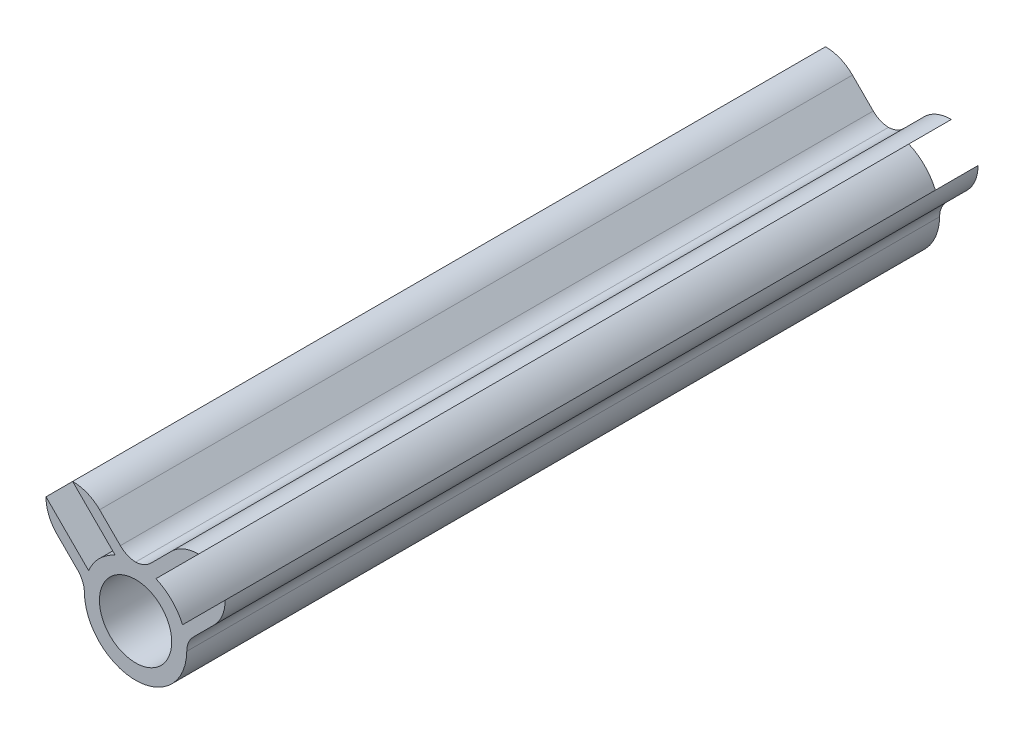
ISO-10303-21;
HEADER;
FILE_DESCRIPTION(('STEP AP214'),'2;1');
FILE_NAME('part.step','',(''),(''),'','','');
FILE_SCHEMA(('AUTOMOTIVE_DESIGN { 1 0 10303 214 1 1 1 1 }'));
ENDSEC;
DATA;
#1=APPLICATION_CONTEXT('core data for automotive mechanical design processes');
#2=APPLICATION_PROTOCOL_DEFINITION('international standard','automotive_design',2000,#1);
#3=PRODUCT_CONTEXT('',#1,'mechanical');
#4=PRODUCT('Part','Part','',(#3));
#5=PRODUCT_RELATED_PRODUCT_CATEGORY('part','',(#4));
#6=PRODUCT_DEFINITION_FORMATION('','',#4);
#7=PRODUCT_DEFINITION_CONTEXT('part definition',#1,'design');
#8=PRODUCT_DEFINITION('design','',#6,#7);
#9=PRODUCT_DEFINITION_SHAPE('','',#8);
#10=(LENGTH_UNIT() NAMED_UNIT(*) SI_UNIT(.MILLI.,.METRE.));
#11=(NAMED_UNIT(*) PLANE_ANGLE_UNIT() SI_UNIT($,.RADIAN.));
#12=(NAMED_UNIT(*) SI_UNIT($,.STERADIAN.) SOLID_ANGLE_UNIT());
#13=UNCERTAINTY_MEASURE_WITH_UNIT(LENGTH_MEASURE(1.E-05),#10,'distance_accuracy_value','');
#14=(GEOMETRIC_REPRESENTATION_CONTEXT(3) GLOBAL_UNCERTAINTY_ASSIGNED_CONTEXT((#13)) GLOBAL_UNIT_ASSIGNED_CONTEXT((#10,
#11,#12)) REPRESENTATION_CONTEXT('',''));
#15=CARTESIAN_POINT('',(0.,0.,0.));
#16=DIRECTION('',(0.,0.,1.));
#17=DIRECTION('',(1.,0.,0.));
#18=AXIS2_PLACEMENT_3D('',#15,#16,#17);
#19=CARTESIAN_POINT('',(0.,0.,50.));
#20=DIRECTION('',(0.,0.,-1.));
#21=DIRECTION('',(-1.,0.,0.));
#22=AXIS2_PLACEMENT_3D('',#19,#20,#21);
#23=CYLINDRICAL_SURFACE('',#22,6.8);
#24=CARTESIAN_POINT('',(0.,0.,-50.));
#25=DIRECTION('',(0.,0.,1.));
#26=DIRECTION('',(1.,0.,0.));
#27=AXIS2_PLACEMENT_3D('',#24,#25,#26);
#28=CIRCLE('',#27,6.8);
#29=CARTESIAN_POINT('',(-2.7038099500959,6.23934385602865,-50.));
#30=VERTEX_POINT('',#29);
#31=CARTESIAN_POINT('',(-6.23934385602864,2.70380995009592,-50.));
#32=VERTEX_POINT('',#31);
#33=EDGE_CURVE('E248',#30,#32,#28,.T.);
#34=ORIENTED_EDGE('',*,*,#33,.T.);
#35=DIRECTION('',(0.,0.,1.));
#36=VECTOR('',#35,1.);
#37=CARTESIAN_POINT('',(-6.23934385602864,2.70380995009592,-79.4106154263704));
#38=LINE('',#37,#36);
#39=CARTESIAN_POINT('',(-6.23934385602864,2.70380995009591,50.));
#40=VERTEX_POINT('',#39);
#41=EDGE_CURVE('E215',#32,#40,#38,.T.);
#42=ORIENTED_EDGE('',*,*,#41,.T.);
#43=CARTESIAN_POINT('',(0.,0.,50.));
#44=DIRECTION('',(0.,0.,1.));
#45=DIRECTION('',(1.,0.,0.));
#46=AXIS2_PLACEMENT_3D('',#43,#44,#45);
#47=CIRCLE('',#46,6.8);
#48=CARTESIAN_POINT('',(-2.7038099500959,6.23934385602865,50.));
#49=VERTEX_POINT('',#48);
#50=EDGE_CURVE('E191',#49,#40,#47,.T.);
#51=ORIENTED_EDGE('',*,*,#50,.F.);
#52=DIRECTION('',(0.,0.,1.));
#53=VECTOR('',#52,1.);
#54=CARTESIAN_POINT('',(-2.7038099500959,6.23934385602865,-79.4106154263704));
#55=LINE('',#54,#53);
#56=EDGE_CURVE('E218',#30,#49,#55,.T.);
#57=ORIENTED_EDGE('',*,*,#56,.F.);
#58=EDGE_LOOP('',(#34,#42,#51,#57));
#59=FACE_BOUND('',#58,.T.);
#60=ADVANCED_FACE('F32',(#59),#23,.T.);
#61=CARTESIAN_POINT('',(6.23934385602864,2.70380995009592,-50.));
#62=VERTEX_POINT('',#61);
#63=CARTESIAN_POINT('',(2.70380995009589,6.23934385602865,-50.));
#64=VERTEX_POINT('',#63);
#65=EDGE_CURVE('E244',#62,#64,#28,.T.);
#66=ORIENTED_EDGE('',*,*,#65,.T.);
#67=DIRECTION('',(0.,0.,1.));
#68=VECTOR('',#67,1.);
#69=CARTESIAN_POINT('',(2.7038099500959,6.23934385602865,-79.4106154263704));
#70=LINE('',#69,#68);
#71=CARTESIAN_POINT('',(2.70380995009589,6.23934385602865,50.));
#72=VERTEX_POINT('',#71);
#73=EDGE_CURVE('E227',#64,#72,#70,.T.);
#74=ORIENTED_EDGE('',*,*,#73,.T.);
#75=CARTESIAN_POINT('',(6.23934385602864,2.70380995009592,50.));
#76=VERTEX_POINT('',#75);
#77=EDGE_CURVE('E245',#76,#72,#47,.T.);
#78=ORIENTED_EDGE('',*,*,#77,.F.);
#79=DIRECTION('',(0.,0.,1.));
#80=VECTOR('',#79,1.);
#81=CARTESIAN_POINT('',(6.23934385602864,2.70380995009592,-79.4106154263704));
#82=LINE('',#81,#80);
#83=EDGE_CURVE('E229',#62,#76,#82,.T.);
#84=ORIENTED_EDGE('',*,*,#83,.F.);
#85=EDGE_LOOP('',(#66,#74,#78,#84));
#86=FACE_BOUND('',#85,.T.);
#87=ADVANCED_FACE('F322',(#86),#23,.T.);
#88=CARTESIAN_POINT('',(0.,0.,50.));
#89=DIRECTION('',(0.,0.,1.));
#90=DIRECTION('',(1.,0.,0.));
#91=AXIS2_PLACEMENT_3D('',#88,#89,#90);
#92=PLANE('',#91);
#93=DIRECTION('',(0.707106781186548,0.707106781186547,0.));
#94=VECTOR('',#93,1.);
#95=CARTESIAN_POINT('',(12.9568582773008,7.30000402780846,50.));
#96=LINE('',#95,#94);
#97=CARTESIAN_POINT('',(7.67816938593905,2.02131513644668,50.));
#98=VERTEX_POINT('',#97);
#99=CARTESIAN_POINT('',(10.4319820427103,4.77512779321795,50.));
#100=VERTEX_POINT('',#99);
#101=EDGE_CURVE('E195',#98,#100,#96,.T.);
#102=ORIENTED_EDGE('',*,*,#101,.T.);
#103=CARTESIAN_POINT('',(6.89644813677758,8.31066169915069,50.));
#104=DIRECTION('',(0.,0.,1.));
#105=DIRECTION('',(1.,0.,0.));
#106=AXIS2_PLACEMENT_3D('',#103,#104,#105);
#107=CIRCLE('',#106,5.);
#108=CARTESIAN_POINT('',(11.896198105521,8.36066419958828,50.));
#109=VERTEX_POINT('',#108);
#110=EDGE_CURVE('E172',#100,#109,#107,.T.);
#111=ORIENTED_EDGE('',*,*,#110,.T.);
#112=DIRECTION('',(-0.707106781186548,-0.707106781186547,0.));
#113=VECTOR('',#112,1.);
#114=CARTESIAN_POINT('',(6.23934385602864,2.70380995009592,50.));
#115=LINE('',#114,#113);
#116=EDGE_CURVE('E203',#109,#76,#115,.T.);
#117=ORIENTED_EDGE('',*,*,#116,.T.);
#118=ORIENTED_EDGE('',*,*,#77,.T.);
#119=DIRECTION('',(0.707106781186547,0.707106781186549,0.));
#120=VECTOR('',#119,1.);
#121=CARTESIAN_POINT('',(8.36066419958827,11.896198105521,50.));
#122=LINE('',#121,#120);
#123=CARTESIAN_POINT('',(8.36066419958827,11.896198105521,50.));
#124=VERTEX_POINT('',#123);
#125=EDGE_CURVE('E206',#72,#124,#122,.T.);
#126=ORIENTED_EDGE('',*,*,#125,.T.);
#127=CARTESIAN_POINT('',(8.31066169915066,6.8964481367776,50.));
#128=DIRECTION('',(0.,0.,1.));
#129=DIRECTION('',(1.,0.,0.));
#130=AXIS2_PLACEMENT_3D('',#127,#128,#129);
#131=CIRCLE('',#130,5.);
#132=CARTESIAN_POINT('',(4.77512779321792,10.4319820427103,50.));
#133=VERTEX_POINT('',#132);
#134=EDGE_CURVE('E173',#124,#133,#131,.T.);
#135=ORIENTED_EDGE('',*,*,#134,.T.);
#136=DIRECTION('',(-0.707106781186548,-0.707106781186547,0.));
#137=VECTOR('',#136,1.);
#138=CARTESIAN_POINT('',(0.,5.65685424949241,50.));
#139=LINE('',#138,#137);
#140=CARTESIAN_POINT('',(2.02131513644663,7.67816938593905,50.));
#141=VERTEX_POINT('',#140);
#142=EDGE_CURVE('E209',#133,#141,#139,.T.);
#143=ORIENTED_EDGE('',*,*,#142,.T.);
#144=CARTESIAN_POINT('',(-0.100005207113013,9.79948972949869,50.));
#145=DIRECTION('',(0.,0.,1.));
#146=DIRECTION('',(1.,0.,0.));
#147=AXIS2_PLACEMENT_3D('',#144,#145,#146);
#148=CIRCLE('',#147,3.);
#149=CARTESIAN_POINT('',(0.,6.80115703305717,50.));
#150=VERTEX_POINT('',#149);
#151=EDGE_CURVE('E281',#141,#150,#148,.F.);
#152=ORIENTED_EDGE('',*,*,#151,.T.);
#153=CARTESIAN_POINT('',(0.100005207113002,9.79948972949869,50.));
#154=DIRECTION('',(0.,0.,1.));
#155=DIRECTION('',(1.,0.,0.));
#156=AXIS2_PLACEMENT_3D('',#153,#154,#155);
#157=CIRCLE('',#156,3.);
#158=CARTESIAN_POINT('',(-2.02131513644664,7.67816938593904,50.));
#159=VERTEX_POINT('',#158);
#160=EDGE_CURVE('E275',#150,#159,#157,.F.);
#161=ORIENTED_EDGE('',*,*,#160,.T.);
#162=DIRECTION('',(-0.707106781186547,0.707106781186548,0.));
#163=VECTOR('',#162,1.);
#164=CARTESIAN_POINT('',(-7.30000402780845,12.9568582773009,50.));
#165=LINE('',#164,#163);
#166=CARTESIAN_POINT('',(-4.77512779321792,10.4319820427103,50.));
#167=VERTEX_POINT('',#166);
#168=EDGE_CURVE('E211',#159,#167,#165,.T.);
#169=ORIENTED_EDGE('',*,*,#168,.T.);
#170=CARTESIAN_POINT('',(-8.31066169915067,6.8964481367776,50.));
#171=DIRECTION('',(0.,0.,1.));
#172=DIRECTION('',(1.,0.,0.));
#173=AXIS2_PLACEMENT_3D('',#170,#171,#172);
#174=CIRCLE('',#173,5.);
#175=CARTESIAN_POINT('',(-8.36066419958827,11.896198105521,50.));
#176=VERTEX_POINT('',#175);
#177=EDGE_CURVE('E286',#167,#176,#174,.T.);
#178=ORIENTED_EDGE('',*,*,#177,.T.);
#179=DIRECTION('',(0.707106781186546,-0.707106781186549,0.));
#180=VECTOR('',#179,1.);
#181=CARTESIAN_POINT('',(-2.7038099500959,6.23934385602865,50.));
#182=LINE('',#181,#180);
#183=EDGE_CURVE('E184',#176,#49,#182,.T.);
#184=ORIENTED_EDGE('',*,*,#183,.T.);
#185=ORIENTED_EDGE('',*,*,#50,.T.);
#186=DIRECTION('',(-0.707106781186547,0.707106781186548,0.));
#187=VECTOR('',#186,1.);
#188=CARTESIAN_POINT('',(-6.23934385602864,2.70380995009592,50.));
#189=LINE('',#188,#187);
#190=CARTESIAN_POINT('',(-11.896198105521,8.3606641995883,50.));
#191=VERTEX_POINT('',#190);
#192=EDGE_CURVE('E180',#40,#191,#189,.T.);
#193=ORIENTED_EDGE('',*,*,#192,.T.);
#194=CARTESIAN_POINT('',(-6.89644813677758,8.31066169915069,50.));
#195=DIRECTION('',(0.,0.,1.));
#196=DIRECTION('',(1.,0.,0.));
#197=AXIS2_PLACEMENT_3D('',#194,#195,#196);
#198=CIRCLE('',#197,5.);
#199=CARTESIAN_POINT('',(-10.4319820427103,4.77512779321796,50.));
#200=VERTEX_POINT('',#199);
#201=EDGE_CURVE('E165',#191,#200,#198,.T.);
#202=ORIENTED_EDGE('',*,*,#201,.T.);
#203=DIRECTION('',(0.707106781186547,-0.707106781186548,0.));
#204=VECTOR('',#203,1.);
#205=CARTESIAN_POINT('',(-12.9568582773008,7.30000402780848,50.));
#206=LINE('',#205,#204);
#207=CARTESIAN_POINT('',(-7.67816938593904,2.02131513644668,50.));
#208=VERTEX_POINT('',#207);
#209=EDGE_CURVE('E192',#200,#208,#206,.T.);
#210=ORIENTED_EDGE('',*,*,#209,.T.);
#211=CARTESIAN_POINT('',(-9.79948972949869,-0.10000520711296,50.));
#212=DIRECTION('',(0.,0.,1.));
#213=DIRECTION('',(1.,0.,0.));
#214=AXIS2_PLACEMENT_3D('',#211,#212,#213);
#215=CIRCLE('',#214,3.);
#216=CARTESIAN_POINT('',(-6.79964593475419,-0.0693913682008293,50.));
#217=VERTEX_POINT('',#216);
#218=EDGE_CURVE('E269',#208,#217,#215,.F.);
#219=ORIENTED_EDGE('',*,*,#218,.T.);
#220=CARTESIAN_POINT('',(6.79964593475419,-0.0693913682008305,50.));
#221=VERTEX_POINT('',#220);
#222=EDGE_CURVE('E241',#217,#221,#47,.T.);
#223=ORIENTED_EDGE('',*,*,#222,.T.);
#224=CARTESIAN_POINT('',(9.79948972949869,-0.100005207112962,50.));
#225=DIRECTION('',(0.,0.,1.));
#226=DIRECTION('',(1.,0.,0.));
#227=AXIS2_PLACEMENT_3D('',#224,#225,#226);
#228=CIRCLE('',#227,3.);
#229=EDGE_CURVE('E271',#221,#98,#228,.F.);
#230=ORIENTED_EDGE('',*,*,#229,.T.);
#231=EDGE_LOOP('',(#102,#111,#117,#118,#126,#135,#143,#152,#161,#169,#178,#184,#185,#193,#202,
#210,#219,#223,#230));
#232=FACE_BOUND('',#231,.T.);
#233=CARTESIAN_POINT('',(0.,0.,50.));
#234=DIRECTION('',(0.,0.,1.));
#235=DIRECTION('',(1.,0.,0.));
#236=AXIS2_PLACEMENT_3D('',#233,#234,#235);
#237=CIRCLE('',#236,4.8);
#238=CARTESIAN_POINT('',(4.8,0.,50.));
#239=VERTEX_POINT('',#238);
#240=EDGE_CURVE('E234',#239,#239,#237,.T.);
#241=ORIENTED_EDGE('',*,*,#240,.F.);
#242=EDGE_LOOP('',(#241));
#243=FACE_BOUND('',#242,.T.);
#244=ADVANCED_FACE('F188',(#232,#243),#92,.T.);
#245=CARTESIAN_POINT('',(0.,0.,-50.));
#246=DIRECTION('',(0.,0.,1.));
#247=DIRECTION('',(1.,0.,0.));
#248=AXIS2_PLACEMENT_3D('',#245,#246,#247);
#249=PLANE('',#248);
#250=DIRECTION('',(0.707106781186548,0.707106781186547,0.));
#251=VECTOR('',#250,1.);
#252=CARTESIAN_POINT('',(6.23934385602864,2.70380995009592,-50.));
#253=LINE('',#252,#251);
#254=CARTESIAN_POINT('',(11.896198105521,8.36066419958828,-50.));
#255=VERTEX_POINT('',#254);
#256=EDGE_CURVE('E305',#62,#255,#253,.T.);
#257=ORIENTED_EDGE('',*,*,#256,.T.);
#258=CARTESIAN_POINT('',(6.89644813677758,8.31066169915069,-50.));
#259=DIRECTION('',(0.,0.,1.));
#260=DIRECTION('',(1.,0.,0.));
#261=AXIS2_PLACEMENT_3D('',#258,#259,#260);
#262=CIRCLE('',#261,5.);
#263=CARTESIAN_POINT('',(10.4319820427103,4.77512779321795,-50.));
#264=VERTEX_POINT('',#263);
#265=EDGE_CURVE('E296',#255,#264,#262,.F.);
#266=ORIENTED_EDGE('',*,*,#265,.T.);
#267=DIRECTION('',(-0.707106781186548,-0.707106781186547,0.));
#268=VECTOR('',#267,1.);
#269=CARTESIAN_POINT('',(12.9568582773008,7.30000402780846,-50.));
#270=LINE('',#269,#268);
#271=CARTESIAN_POINT('',(7.67816938593905,2.02131513644668,-50.));
#272=VERTEX_POINT('',#271);
#273=EDGE_CURVE('E303',#264,#272,#270,.T.);
#274=ORIENTED_EDGE('',*,*,#273,.T.);
#275=CARTESIAN_POINT('',(9.79948972949869,-0.100005207112962,-50.));
#276=DIRECTION('',(0.,0.,1.));
#277=DIRECTION('',(1.,0.,0.));
#278=AXIS2_PLACEMENT_3D('',#275,#276,#277);
#279=CIRCLE('',#278,3.);
#280=CARTESIAN_POINT('',(6.79964593475419,-0.0693913682008305,-50.));
#281=VERTEX_POINT('',#280);
#282=EDGE_CURVE('E273',#272,#281,#279,.T.);
#283=ORIENTED_EDGE('',*,*,#282,.T.);
#284=CARTESIAN_POINT('',(-6.79964593475419,-0.0693913682008293,-50.));
#285=VERTEX_POINT('',#284);
#286=EDGE_CURVE('E237',#285,#281,#28,.T.);
#287=ORIENTED_EDGE('',*,*,#286,.F.);
#288=CARTESIAN_POINT('',(-9.79948972949869,-0.10000520711296,-50.));
#289=DIRECTION('',(0.,0.,1.));
#290=DIRECTION('',(1.,0.,0.));
#291=AXIS2_PLACEMENT_3D('',#288,#289,#290);
#292=CIRCLE('',#291,3.);
#293=CARTESIAN_POINT('',(-7.67816938593904,2.02131513644668,-50.));
#294=VERTEX_POINT('',#293);
#295=EDGE_CURVE('E267',#285,#294,#292,.T.);
#296=ORIENTED_EDGE('',*,*,#295,.T.);
#297=DIRECTION('',(-0.707106781186547,0.707106781186548,0.));
#298=VECTOR('',#297,1.);
#299=CARTESIAN_POINT('',(-12.9568582773008,7.30000402780848,-50.));
#300=LINE('',#299,#298);
#301=CARTESIAN_POINT('',(-10.4319820427103,4.77512779321796,-50.));
#302=VERTEX_POINT('',#301);
#303=EDGE_CURVE('E217',#294,#302,#300,.T.);
#304=ORIENTED_EDGE('',*,*,#303,.T.);
#305=CARTESIAN_POINT('',(-6.89644813677758,8.31066169915069,-50.));
#306=DIRECTION('',(0.,0.,1.));
#307=DIRECTION('',(1.,0.,0.));
#308=AXIS2_PLACEMENT_3D('',#305,#306,#307);
#309=CIRCLE('',#308,5.);
#310=CARTESIAN_POINT('',(-11.896198105521,8.3606641995883,-50.));
#311=VERTEX_POINT('',#310);
#312=EDGE_CURVE('E294',#302,#311,#309,.F.);
#313=ORIENTED_EDGE('',*,*,#312,.T.);
#314=DIRECTION('',(0.707106781186547,-0.707106781186548,0.));
#315=VECTOR('',#314,1.);
#316=CARTESIAN_POINT('',(-6.23934385602864,2.70380995009592,-50.));
#317=LINE('',#316,#315);
#318=EDGE_CURVE('E182',#311,#32,#317,.T.);
#319=ORIENTED_EDGE('',*,*,#318,.T.);
#320=ORIENTED_EDGE('',*,*,#33,.F.);
#321=DIRECTION('',(-0.707106781186546,0.707106781186549,0.));
#322=VECTOR('',#321,1.);
#323=CARTESIAN_POINT('',(-2.7038099500959,6.23934385602865,-50.));
#324=LINE('',#323,#322);
#325=CARTESIAN_POINT('',(-8.36066419958827,11.896198105521,-50.));
#326=VERTEX_POINT('',#325);
#327=EDGE_CURVE('E354',#30,#326,#324,.T.);
#328=ORIENTED_EDGE('',*,*,#327,.T.);
#329=CARTESIAN_POINT('',(-8.31066169915067,6.8964481367776,-50.));
#330=DIRECTION('',(0.,0.,1.));
#331=DIRECTION('',(1.,0.,0.));
#332=AXIS2_PLACEMENT_3D('',#329,#330,#331);
#333=CIRCLE('',#332,5.);
#334=CARTESIAN_POINT('',(-4.77512779321793,10.4319820427103,-50.));
#335=VERTEX_POINT('',#334);
#336=EDGE_CURVE('E290',#326,#335,#333,.F.);
#337=ORIENTED_EDGE('',*,*,#336,.T.);
#338=DIRECTION('',(0.707106781186547,-0.707106781186548,0.));
#339=VECTOR('',#338,1.);
#340=CARTESIAN_POINT('',(-7.30000402780845,12.9568582773009,-50.));
#341=LINE('',#340,#339);
#342=CARTESIAN_POINT('',(-2.02131513644664,7.67816938593905,-50.));
#343=VERTEX_POINT('',#342);
#344=EDGE_CURVE('E352',#335,#343,#341,.T.);
#345=ORIENTED_EDGE('',*,*,#344,.T.);
#346=CARTESIAN_POINT('',(0.100005207113002,9.79948972949869,-50.));
#347=DIRECTION('',(0.,0.,1.));
#348=DIRECTION('',(1.,0.,0.));
#349=AXIS2_PLACEMENT_3D('',#346,#347,#348);
#350=CIRCLE('',#349,3.);
#351=CARTESIAN_POINT('',(0.,6.80115703305717,-50.));
#352=VERTEX_POINT('',#351);
#353=EDGE_CURVE('E277',#343,#352,#350,.T.);
#354=ORIENTED_EDGE('',*,*,#353,.T.);
#355=CARTESIAN_POINT('',(-0.100005207113013,9.79948972949869,-50.));
#356=DIRECTION('',(0.,0.,1.));
#357=DIRECTION('',(1.,0.,0.));
#358=AXIS2_PLACEMENT_3D('',#355,#356,#357);
#359=CIRCLE('',#358,3.);
#360=CARTESIAN_POINT('',(2.02131513644663,7.67816938593905,-50.));
#361=VERTEX_POINT('',#360);
#362=EDGE_CURVE('E279',#352,#361,#359,.T.);
#363=ORIENTED_EDGE('',*,*,#362,.T.);
#364=DIRECTION('',(0.707106781186548,0.707106781186547,0.));
#365=VECTOR('',#364,1.);
#366=CARTESIAN_POINT('',(0.,5.65685424949241,-50.));
#367=LINE('',#366,#365);
#368=CARTESIAN_POINT('',(4.77512779321792,10.4319820427103,-50.));
#369=VERTEX_POINT('',#368);
#370=EDGE_CURVE('E337',#361,#369,#367,.T.);
#371=ORIENTED_EDGE('',*,*,#370,.T.);
#372=CARTESIAN_POINT('',(8.31066169915066,6.8964481367776,-50.));
#373=DIRECTION('',(0.,0.,1.));
#374=DIRECTION('',(1.,0.,0.));
#375=AXIS2_PLACEMENT_3D('',#372,#373,#374);
#376=CIRCLE('',#375,5.);
#377=CARTESIAN_POINT('',(8.36066419958827,11.896198105521,-50.));
#378=VERTEX_POINT('',#377);
#379=EDGE_CURVE('E292',#369,#378,#376,.F.);
#380=ORIENTED_EDGE('',*,*,#379,.T.);
#381=DIRECTION('',(-0.707106781186546,-0.707106781186549,0.));
#382=VECTOR('',#381,1.);
#383=CARTESIAN_POINT('',(8.36066419958827,11.896198105521,-50.));
#384=LINE('',#383,#382);
#385=EDGE_CURVE('E330',#378,#64,#384,.T.);
#386=ORIENTED_EDGE('',*,*,#385,.T.);
#387=ORIENTED_EDGE('',*,*,#65,.F.);
#388=EDGE_LOOP('',(#257,#266,#274,#283,#287,#296,#304,#313,#319,#320,#328,#337,#345,#354,#363,
#371,#380,#386,#387));
#389=FACE_BOUND('',#388,.T.);
#390=CARTESIAN_POINT('',(0.,0.,-50.));
#391=DIRECTION('',(0.,0.,1.));
#392=DIRECTION('',(1.,0.,0.));
#393=AXIS2_PLACEMENT_3D('',#390,#391,#392);
#394=CIRCLE('',#393,4.8);
#395=CARTESIAN_POINT('',(4.8,0.,-50.));
#396=VERTEX_POINT('',#395);
#397=EDGE_CURVE('E238',#396,#396,#394,.T.);
#398=ORIENTED_EDGE('',*,*,#397,.T.);
#399=EDGE_LOOP('',(#398));
#400=FACE_BOUND('',#399,.T.);
#401=ADVANCED_FACE('F301',(#389,#400),#249,.F.);
#402=ORIENTED_EDGE('',*,*,#222,.F.);
#403=DIRECTION('',(0.,0.,-1.));
#404=VECTOR('',#403,1.);
#405=CARTESIAN_POINT('',(-6.79964593475419,-0.0693913682008293,50.));
#406=LINE('',#405,#404);
#407=EDGE_CURVE('E252',#217,#285,#406,.T.);
#408=ORIENTED_EDGE('',*,*,#407,.T.);
#409=ORIENTED_EDGE('',*,*,#286,.T.);
#410=DIRECTION('',(0.,0.,-1.));
#411=VECTOR('',#410,1.);
#412=CARTESIAN_POINT('',(6.79964593475419,-0.0693913682008305,50.));
#413=LINE('',#412,#411);
#414=EDGE_CURVE('E249',#281,#221,#413,.F.);
#415=ORIENTED_EDGE('',*,*,#414,.T.);
#416=EDGE_LOOP('',(#402,#408,#409,#415));
#417=FACE_BOUND('',#416,.T.);
#418=ADVANCED_FACE('F369',(#417),#23,.T.);
#419=CARTESIAN_POINT('',(0.,0.,50.));
#420=DIRECTION('',(0.,0.,-1.));
#421=DIRECTION('',(-1.,0.,0.));
#422=AXIS2_PLACEMENT_3D('',#419,#420,#421);
#423=CYLINDRICAL_SURFACE('',#422,4.8);
#424=ORIENTED_EDGE('',*,*,#240,.T.);
#425=EDGE_LOOP('',(#424));
#426=FACE_BOUND('',#425,.T.);
#427=ORIENTED_EDGE('',*,*,#397,.F.);
#428=EDGE_LOOP('',(#427));
#429=FACE_BOUND('',#428,.T.);
#430=ADVANCED_FACE('F390',(#426,#429),#423,.F.);
#431=CARTESIAN_POINT('',(-12.9568582773008,7.30000402780848,-79.4106154263704));
#432=DIRECTION('',(-0.707106781186548,-0.707106781186547,0.));
#433=DIRECTION('',(0.707106781186547,-0.707106781186548,0.));
#434=AXIS2_PLACEMENT_3D('',#431,#432,#433);
#435=PLANE('',#434);
#436=ORIENTED_EDGE('',*,*,#209,.F.);
#437=DIRECTION('',(0.,0.,1.));
#438=VECTOR('',#437,1.);
#439=CARTESIAN_POINT('',(-10.4319820427103,4.77512779321796,-50.));
#440=LINE('',#439,#438);
#441=EDGE_CURVE('E47',#200,#302,#440,.F.);
#442=ORIENTED_EDGE('',*,*,#441,.T.);
#443=ORIENTED_EDGE('',*,*,#303,.F.);
#444=DIRECTION('',(0.,0.,-1.));
#445=VECTOR('',#444,1.);
#446=CARTESIAN_POINT('',(-7.67816938593904,2.02131513644668,-79.4106154263704));
#447=LINE('',#446,#445);
#448=EDGE_CURVE('E255',#294,#208,#447,.F.);
#449=ORIENTED_EDGE('',*,*,#448,.T.);
#450=EDGE_LOOP('',(#436,#442,#443,#449));
#451=FACE_BOUND('',#450,.T.);
#452=ADVANCED_FACE('F362',(#451),#435,.T.);
#453=CARTESIAN_POINT('',(-6.23934385602864,2.70380995009592,-79.4106154263704));
#454=DIRECTION('',(0.707106781186548,0.707106781186547,0.));
#455=DIRECTION('',(-0.707106781186547,0.707106781186548,0.));
#456=AXIS2_PLACEMENT_3D('',#453,#454,#455);
#457=PLANE('',#456);
#458=ORIENTED_EDGE('',*,*,#318,.F.);
#459=DIRECTION('',(0.,0.,1.));
#460=VECTOR('',#459,1.);
#461=CARTESIAN_POINT('',(-11.896198105521,8.3606641995883,-79.4106154263704));
#462=LINE('',#461,#460);
#463=EDGE_CURVE('E169',#311,#191,#462,.T.);
#464=ORIENTED_EDGE('',*,*,#463,.T.);
#465=ORIENTED_EDGE('',*,*,#192,.F.);
#466=ORIENTED_EDGE('',*,*,#41,.F.);
#467=EDGE_LOOP('',(#458,#464,#465,#466));
#468=FACE_BOUND('',#467,.T.);
#469=ADVANCED_FACE('F178',(#468),#457,.T.);
#470=CARTESIAN_POINT('',(-7.30000402780845,12.9568582773009,-79.4106154263704));
#471=DIRECTION('',(0.707106781186548,0.707106781186547,0.));
#472=DIRECTION('',(-0.707106781186547,0.707106781186548,0.));
#473=AXIS2_PLACEMENT_3D('',#470,#471,#472);
#474=PLANE('',#473);
#475=ORIENTED_EDGE('',*,*,#344,.F.);
#476=DIRECTION('',(0.,0.,-1.));
#477=VECTOR('',#476,1.);
#478=CARTESIAN_POINT('',(-4.77512779321793,10.4319820427103,50.));
#479=LINE('',#478,#477);
#480=EDGE_CURVE('E11',#335,#167,#479,.F.);
#481=ORIENTED_EDGE('',*,*,#480,.T.);
#482=ORIENTED_EDGE('',*,*,#168,.F.);
#483=DIRECTION('',(0.,0.,-1.));
#484=VECTOR('',#483,1.);
#485=CARTESIAN_POINT('',(-2.02131513644664,7.67816938593905,-79.4106154263704));
#486=LINE('',#485,#484);
#487=EDGE_CURVE('E261',#159,#343,#486,.T.);
#488=ORIENTED_EDGE('',*,*,#487,.T.);
#489=EDGE_LOOP('',(#475,#481,#482,#488));
#490=FACE_BOUND('',#489,.T.);
#491=ADVANCED_FACE('F348',(#490),#474,.T.);
#492=CARTESIAN_POINT('',(-2.7038099500959,6.23934385602865,-79.4106154263704));
#493=DIRECTION('',(-0.707106781186549,-0.707106781186546,0.));
#494=DIRECTION('',(0.707106781186546,-0.707106781186549,0.));
#495=AXIS2_PLACEMENT_3D('',#492,#493,#494);
#496=PLANE('',#495);
#497=ORIENTED_EDGE('',*,*,#327,.F.);
#498=ORIENTED_EDGE('',*,*,#56,.T.);
#499=ORIENTED_EDGE('',*,*,#183,.F.);
#500=DIRECTION('',(0.,0.,1.));
#501=VECTOR('',#500,1.);
#502=CARTESIAN_POINT('',(-8.36066419958827,11.896198105521,-79.4106154263704));
#503=LINE('',#502,#501);
#504=EDGE_CURVE('E221',#326,#176,#503,.T.);
#505=ORIENTED_EDGE('',*,*,#504,.F.);
#506=EDGE_LOOP('',(#497,#498,#499,#505));
#507=FACE_BOUND('',#506,.T.);
#508=ADVANCED_FACE('F412',(#507),#496,.T.);
#509=CARTESIAN_POINT('',(8.36066419958827,11.896198105521,-79.4106154263704));
#510=DIRECTION('',(0.707106781186549,-0.707106781186546,0.));
#511=DIRECTION('',(0.707106781186546,0.707106781186549,0.));
#512=AXIS2_PLACEMENT_3D('',#509,#510,#511);
#513=PLANE('',#512);
#514=ORIENTED_EDGE('',*,*,#385,.F.);
#515=DIRECTION('',(0.,0.,1.));
#516=VECTOR('',#515,1.);
#517=CARTESIAN_POINT('',(8.36066419958827,11.896198105521,-79.4106154263704));
#518=LINE('',#517,#516);
#519=EDGE_CURVE('E224',#378,#124,#518,.T.);
#520=ORIENTED_EDGE('',*,*,#519,.T.);
#521=ORIENTED_EDGE('',*,*,#125,.F.);
#522=ORIENTED_EDGE('',*,*,#73,.F.);
#523=EDGE_LOOP('',(#514,#520,#521,#522));
#524=FACE_BOUND('',#523,.T.);
#525=ADVANCED_FACE('F328',(#524),#513,.T.);
#526=CARTESIAN_POINT('',(0.,5.65685424949241,-79.4106154263704));
#527=DIRECTION('',(-0.707106781186547,0.707106781186548,0.));
#528=DIRECTION('',(-0.707106781186548,-0.707106781186547,0.));
#529=AXIS2_PLACEMENT_3D('',#526,#527,#528);
#530=PLANE('',#529);
#531=ORIENTED_EDGE('',*,*,#142,.F.);
#532=DIRECTION('',(0.,0.,1.));
#533=VECTOR('',#532,1.);
#534=CARTESIAN_POINT('',(4.77512779321792,10.4319820427103,-50.));
#535=LINE('',#534,#533);
#536=EDGE_CURVE('E40',#133,#369,#535,.F.);
#537=ORIENTED_EDGE('',*,*,#536,.T.);
#538=ORIENTED_EDGE('',*,*,#370,.F.);
#539=DIRECTION('',(0.,0.,-1.));
#540=VECTOR('',#539,1.);
#541=CARTESIAN_POINT('',(2.02131513644663,7.67816938593905,-79.4106154263704));
#542=LINE('',#541,#540);
#543=EDGE_CURVE('E264',#361,#141,#542,.F.);
#544=ORIENTED_EDGE('',*,*,#543,.T.);
#545=EDGE_LOOP('',(#531,#537,#538,#544));
#546=FACE_BOUND('',#545,.T.);
#547=ADVANCED_FACE('F334',(#546),#530,.T.);
#548=CARTESIAN_POINT('',(12.9568582773008,7.30000402780846,-79.4106154263704));
#549=DIRECTION('',(0.707106781186547,-0.707106781186548,0.));
#550=DIRECTION('',(0.707106781186548,0.707106781186547,0.));
#551=AXIS2_PLACEMENT_3D('',#548,#549,#550);
#552=PLANE('',#551);
#553=ORIENTED_EDGE('',*,*,#273,.F.);
#554=DIRECTION('',(0.,0.,-1.));
#555=VECTOR('',#554,1.);
#556=CARTESIAN_POINT('',(10.4319820427103,4.77512779321795,50.));
#557=LINE('',#556,#555);
#558=EDGE_CURVE('E282',#264,#100,#557,.F.);
#559=ORIENTED_EDGE('',*,*,#558,.T.);
#560=ORIENTED_EDGE('',*,*,#101,.F.);
#561=DIRECTION('',(0.,0.,-1.));
#562=VECTOR('',#561,1.);
#563=CARTESIAN_POINT('',(7.67816938593905,2.02131513644668,-79.4106154263704));
#564=LINE('',#563,#562);
#565=EDGE_CURVE('E258',#98,#272,#564,.T.);
#566=ORIENTED_EDGE('',*,*,#565,.T.);
#567=EDGE_LOOP('',(#553,#559,#560,#566));
#568=FACE_BOUND('',#567,.T.);
#569=ADVANCED_FACE('F310',(#568),#552,.T.);
#570=CARTESIAN_POINT('',(6.23934385602864,2.70380995009592,-79.4106154263704));
#571=DIRECTION('',(-0.707106781186547,0.707106781186548,0.));
#572=DIRECTION('',(-0.707106781186548,-0.707106781186547,0.));
#573=AXIS2_PLACEMENT_3D('',#570,#571,#572);
#574=PLANE('',#573);
#575=ORIENTED_EDGE('',*,*,#256,.F.);
#576=ORIENTED_EDGE('',*,*,#83,.T.);
#577=ORIENTED_EDGE('',*,*,#116,.F.);
#578=DIRECTION('',(0.,0.,1.));
#579=VECTOR('',#578,1.);
#580=CARTESIAN_POINT('',(11.896198105521,8.36066419958828,-79.4106154263704));
#581=LINE('',#580,#579);
#582=EDGE_CURVE('E183',#255,#109,#581,.T.);
#583=ORIENTED_EDGE('',*,*,#582,.F.);
#584=EDGE_LOOP('',(#575,#576,#577,#583));
#585=FACE_BOUND('',#584,.T.);
#586=ADVANCED_FACE('F319',(#585),#574,.T.);
#587=CARTESIAN_POINT('',(-9.79948972949869,-0.10000520711296,50.));
#588=DIRECTION('',(0.,0.,-1.));
#589=DIRECTION('',(-1.,0.,0.));
#590=AXIS2_PLACEMENT_3D('',#587,#588,#589);
#591=CYLINDRICAL_SURFACE('',#590,3.);
#592=ORIENTED_EDGE('',*,*,#218,.F.);
#593=ORIENTED_EDGE('',*,*,#448,.F.);
#594=ORIENTED_EDGE('',*,*,#295,.F.);
#595=ORIENTED_EDGE('',*,*,#407,.F.);
#596=EDGE_LOOP('',(#592,#593,#594,#595));
#597=FACE_BOUND('',#596,.T.);
#598=ADVANCED_FACE('F365',(#597),#591,.F.);
#599=CARTESIAN_POINT('',(9.79948972949869,-0.100005207112962,50.));
#600=DIRECTION('',(0.,0.,-1.));
#601=DIRECTION('',(-1.,0.,0.));
#602=AXIS2_PLACEMENT_3D('',#599,#600,#601);
#603=CYLINDRICAL_SURFACE('',#602,3.);
#604=ORIENTED_EDGE('',*,*,#282,.F.);
#605=ORIENTED_EDGE('',*,*,#565,.F.);
#606=ORIENTED_EDGE('',*,*,#229,.F.);
#607=ORIENTED_EDGE('',*,*,#414,.F.);
#608=EDGE_LOOP('',(#604,#605,#606,#607));
#609=FACE_BOUND('',#608,.T.);
#610=ADVANCED_FACE('F372',(#609),#603,.F.);
#611=CARTESIAN_POINT('',(-0.100005207113013,9.79948972949869,50.));
#612=DIRECTION('',(0.,0.,-1.));
#613=DIRECTION('',(-1.,0.,0.));
#614=AXIS2_PLACEMENT_3D('',#611,#612,#613);
#615=CYLINDRICAL_SURFACE('',#614,3.);
#616=ORIENTED_EDGE('',*,*,#543,.F.);
#617=ORIENTED_EDGE('',*,*,#362,.F.);
#618=DIRECTION('',(0.,0.,-1.));
#619=VECTOR('',#618,1.);
#620=CARTESIAN_POINT('',(0.,6.80115703305717,0.));
#621=LINE('',#620,#619);
#622=EDGE_CURVE('E193',#150,#352,#621,.T.);
#623=ORIENTED_EDGE('',*,*,#622,.F.);
#624=ORIENTED_EDGE('',*,*,#151,.F.);
#625=EDGE_LOOP('',(#616,#617,#623,#624));
#626=FACE_BOUND('',#625,.T.);
#627=ADVANCED_FACE('F341',(#626),#615,.F.);
#628=CARTESIAN_POINT('',(0.100005207113002,9.79948972949869,50.));
#629=DIRECTION('',(0.,0.,-1.));
#630=DIRECTION('',(-1.,0.,0.));
#631=AXIS2_PLACEMENT_3D('',#628,#629,#630);
#632=CYLINDRICAL_SURFACE('',#631,3.);
#633=ORIENTED_EDGE('',*,*,#353,.F.);
#634=ORIENTED_EDGE('',*,*,#487,.F.);
#635=ORIENTED_EDGE('',*,*,#160,.F.);
#636=ORIENTED_EDGE('',*,*,#622,.T.);
#637=EDGE_LOOP('',(#633,#634,#635,#636));
#638=FACE_BOUND('',#637,.T.);
#639=ADVANCED_FACE('F351',(#638),#632,.F.);
#640=CARTESIAN_POINT('',(6.89644813677758,8.31066169915069,-79.4106154263704));
#641=DIRECTION('',(0.,0.,1.));
#642=DIRECTION('',(1.,0.,0.));
#643=AXIS2_PLACEMENT_3D('',#640,#641,#642);
#644=CYLINDRICAL_SURFACE('',#643,5.);
#645=ORIENTED_EDGE('',*,*,#265,.F.);
#646=ORIENTED_EDGE('',*,*,#582,.T.);
#647=ORIENTED_EDGE('',*,*,#110,.F.);
#648=ORIENTED_EDGE('',*,*,#558,.F.);
#649=EDGE_LOOP('',(#645,#646,#647,#648));
#650=FACE_BOUND('',#649,.T.);
#651=ADVANCED_FACE('F315',(#650),#644,.T.);
#652=CARTESIAN_POINT('',(-6.89644813677758,8.31066169915069,-79.4106154263704));
#653=DIRECTION('',(0.,0.,-1.));
#654=DIRECTION('',(-1.,0.,0.));
#655=AXIS2_PLACEMENT_3D('',#652,#653,#654);
#656=CYLINDRICAL_SURFACE('',#655,5.);
#657=ORIENTED_EDGE('',*,*,#312,.F.);
#658=ORIENTED_EDGE('',*,*,#441,.F.);
#659=ORIENTED_EDGE('',*,*,#201,.F.);
#660=ORIENTED_EDGE('',*,*,#463,.F.);
#661=EDGE_LOOP('',(#657,#658,#659,#660));
#662=FACE_BOUND('',#661,.T.);
#663=ADVANCED_FACE('F168',(#662),#656,.T.);
#664=CARTESIAN_POINT('',(8.31066169915066,6.8964481367776,-79.4106154263704));
#665=DIRECTION('',(0.,0.,-1.));
#666=DIRECTION('',(-1.,0.,0.));
#667=AXIS2_PLACEMENT_3D('',#664,#665,#666);
#668=CYLINDRICAL_SURFACE('',#667,5.);
#669=ORIENTED_EDGE('',*,*,#379,.F.);
#670=ORIENTED_EDGE('',*,*,#536,.F.);
#671=ORIENTED_EDGE('',*,*,#134,.F.);
#672=ORIENTED_EDGE('',*,*,#519,.F.);
#673=EDGE_LOOP('',(#669,#670,#671,#672));
#674=FACE_BOUND('',#673,.T.);
#675=ADVANCED_FACE('F333',(#674),#668,.T.);
#676=CARTESIAN_POINT('',(-8.31066169915067,6.8964481367776,-79.4106154263704));
#677=DIRECTION('',(0.,0.,1.));
#678=DIRECTION('',(1.,0.,0.));
#679=AXIS2_PLACEMENT_3D('',#676,#677,#678);
#680=CYLINDRICAL_SURFACE('',#679,5.);
#681=ORIENTED_EDGE('',*,*,#336,.F.);
#682=ORIENTED_EDGE('',*,*,#504,.T.);
#683=ORIENTED_EDGE('',*,*,#177,.F.);
#684=ORIENTED_EDGE('',*,*,#480,.F.);
#685=EDGE_LOOP('',(#681,#682,#683,#684));
#686=FACE_BOUND('',#685,.T.);
#687=ADVANCED_FACE('F34',(#686),#680,.T.);
#688=CLOSED_SHELL('',(#60,#87,#244,#401,#418,#430,#452,#469,#491,#508,#525,#547,#569,#586,#598,
#610,#627,#639,#651,#663,#675,#687));
#689=MANIFOLD_SOLID_BREP('B2',#688);
#690=ADVANCED_BREP_SHAPE_REPRESENTATION('',(#18,#689),#14);
#691=SHAPE_DEFINITION_REPRESENTATION(#9,#690);
ENDSEC;
END-ISO-10303-21;
